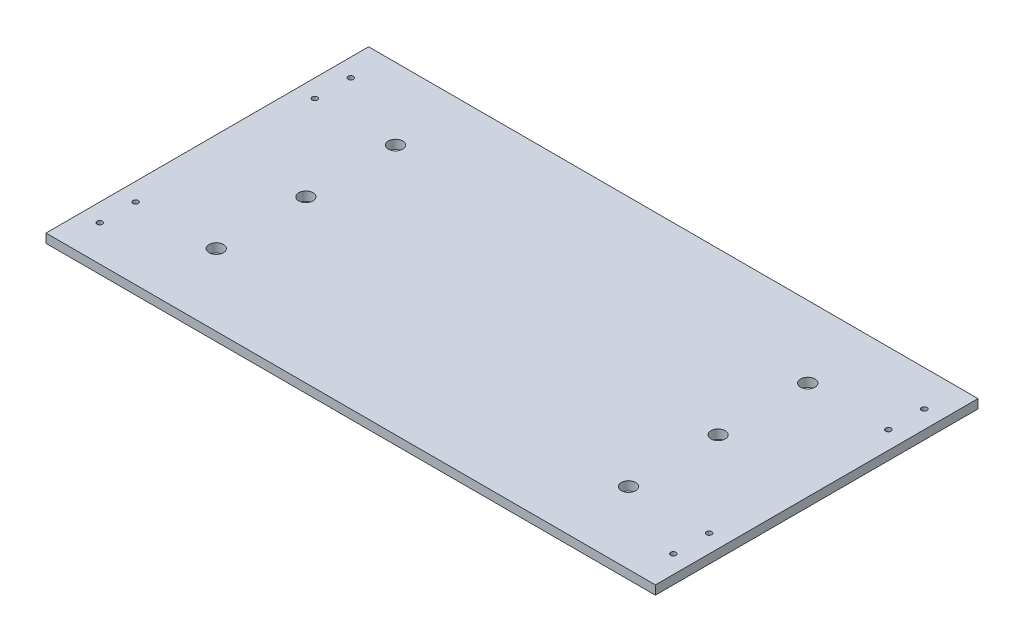
ISO-10303-21;
HEADER;
FILE_DESCRIPTION(('STEP AP214'),'2;1');
FILE_NAME('part.step','',(''),(''),'','','');
FILE_SCHEMA(('AUTOMOTIVE_DESIGN { 1 0 10303 214 1 1 1 1 }'));
ENDSEC;
DATA;
#1=APPLICATION_CONTEXT('core data for automotive mechanical design processes');
#2=APPLICATION_PROTOCOL_DEFINITION('international standard','automotive_design',2000,#1);
#3=PRODUCT_CONTEXT('',#1,'mechanical');
#4=PRODUCT('Part','Part','',(#3));
#5=PRODUCT_RELATED_PRODUCT_CATEGORY('part','',(#4));
#6=PRODUCT_DEFINITION_FORMATION('','',#4);
#7=PRODUCT_DEFINITION_CONTEXT('part definition',#1,'design');
#8=PRODUCT_DEFINITION('design','',#6,#7);
#9=PRODUCT_DEFINITION_SHAPE('','',#8);
#10=(LENGTH_UNIT() NAMED_UNIT(*) SI_UNIT(.MILLI.,.METRE.));
#11=(NAMED_UNIT(*) PLANE_ANGLE_UNIT() SI_UNIT($,.RADIAN.));
#12=(NAMED_UNIT(*) SI_UNIT($,.STERADIAN.) SOLID_ANGLE_UNIT());
#13=UNCERTAINTY_MEASURE_WITH_UNIT(LENGTH_MEASURE(1.E-05),#10,'distance_accuracy_value','');
#14=(GEOMETRIC_REPRESENTATION_CONTEXT(3) GLOBAL_UNCERTAINTY_ASSIGNED_CONTEXT((#13)) GLOBAL_UNIT_ASSIGNED_CONTEXT((#10,
#11,#12)) REPRESENTATION_CONTEXT('',''));
#15=CARTESIAN_POINT('',(0.,0.,0.));
#16=DIRECTION('',(0.,0.,1.));
#17=DIRECTION('',(1.,0.,0.));
#18=AXIS2_PLACEMENT_3D('',#15,#16,#17);
#19=CARTESIAN_POINT('',(0.,5.,0.));
#20=DIRECTION('',(-1.,0.,0.));
#21=DIRECTION('',(0.,0.,1.));
#22=AXIS2_PLACEMENT_3D('',#19,#20,#21);
#23=PLANE('',#22);
#24=DIRECTION('',(0.,0.,-1.));
#25=VECTOR('',#24,1.);
#26=CARTESIAN_POINT('',(0.,0.,0.));
#27=LINE('',#26,#25);
#28=CARTESIAN_POINT('',(0.,0.,0.));
#29=VERTEX_POINT('',#28);
#30=CARTESIAN_POINT('',(0.,0.,-180.));
#31=VERTEX_POINT('',#30);
#32=EDGE_CURVE('E98',#29,#31,#27,.T.);
#33=ORIENTED_EDGE('',*,*,#32,.T.);
#34=DIRECTION('',(0.,-1.,0.));
#35=VECTOR('',#34,1.);
#36=CARTESIAN_POINT('',(0.,5.,-180.));
#37=LINE('',#36,#35);
#38=CARTESIAN_POINT('',(0.,5.,-180.));
#39=VERTEX_POINT('',#38);
#40=EDGE_CURVE('E11',#39,#31,#37,.T.);
#41=ORIENTED_EDGE('',*,*,#40,.F.);
#42=DIRECTION('',(0.,0.,-1.));
#43=VECTOR('',#42,1.);
#44=CARTESIAN_POINT('',(0.,5.,0.));
#45=LINE('',#44,#43);
#46=CARTESIAN_POINT('',(0.,5.,0.));
#47=VERTEX_POINT('',#46);
#48=EDGE_CURVE('E86',#47,#39,#45,.T.);
#49=ORIENTED_EDGE('',*,*,#48,.F.);
#50=DIRECTION('',(0.,-1.,0.));
#51=VECTOR('',#50,1.);
#52=CARTESIAN_POINT('',(0.,5.,0.));
#53=LINE('',#52,#51);
#54=EDGE_CURVE('E94',#47,#29,#53,.T.);
#55=ORIENTED_EDGE('',*,*,#54,.T.);
#56=EDGE_LOOP('',(#33,#41,#49,#55));
#57=FACE_BOUND('',#56,.T.);
#58=ADVANCED_FACE('F35',(#57),#23,.F.);
#59=CARTESIAN_POINT('',(0.,5.,-180.));
#60=DIRECTION('',(0.,0.,1.));
#61=DIRECTION('',(1.,0.,0.));
#62=AXIS2_PLACEMENT_3D('',#59,#60,#61);
#63=PLANE('',#62);
#64=DIRECTION('',(-1.,0.,0.));
#65=VECTOR('',#64,1.);
#66=CARTESIAN_POINT('',(0.,0.,-180.));
#67=LINE('',#66,#65);
#68=CARTESIAN_POINT('',(-340.,0.,-180.));
#69=VERTEX_POINT('',#68);
#70=EDGE_CURVE('E90',#31,#69,#67,.T.);
#71=ORIENTED_EDGE('',*,*,#70,.T.);
#72=DIRECTION('',(0.,-1.,0.));
#73=VECTOR('',#72,1.);
#74=CARTESIAN_POINT('',(-340.,5.,-180.));
#75=LINE('',#74,#73);
#76=CARTESIAN_POINT('',(-340.,5.,-180.));
#77=VERTEX_POINT('',#76);
#78=EDGE_CURVE('E43',#77,#69,#75,.T.);
#79=ORIENTED_EDGE('',*,*,#78,.F.);
#80=DIRECTION('',(-1.,0.,0.));
#81=VECTOR('',#80,1.);
#82=CARTESIAN_POINT('',(0.,5.,-180.));
#83=LINE('',#82,#81);
#84=EDGE_CURVE('E81',#39,#77,#83,.T.);
#85=ORIENTED_EDGE('',*,*,#84,.F.);
#86=ORIENTED_EDGE('',*,*,#40,.T.);
#87=EDGE_LOOP('',(#71,#79,#85,#86));
#88=FACE_BOUND('',#87,.T.);
#89=ADVANCED_FACE('F89',(#88),#63,.F.);
#90=CARTESIAN_POINT('',(-340.,5.,0.));
#91=DIRECTION('',(1.,0.,0.));
#92=DIRECTION('',(0.,0.,-1.));
#93=AXIS2_PLACEMENT_3D('',#90,#91,#92);
#94=PLANE('',#93);
#95=DIRECTION('',(0.,0.,1.));
#96=VECTOR('',#95,1.);
#97=CARTESIAN_POINT('',(-340.,0.,0.));
#98=LINE('',#97,#96);
#99=CARTESIAN_POINT('',(-340.,0.,0.));
#100=VERTEX_POINT('',#99);
#101=EDGE_CURVE('E68',#69,#100,#98,.T.);
#102=ORIENTED_EDGE('',*,*,#101,.T.);
#103=DIRECTION('',(0.,-1.,0.));
#104=VECTOR('',#103,1.);
#105=CARTESIAN_POINT('',(-340.,5.,0.));
#106=LINE('',#105,#104);
#107=CARTESIAN_POINT('',(-340.,5.,0.));
#108=VERTEX_POINT('',#107);
#109=EDGE_CURVE('E91',#108,#100,#106,.T.);
#110=ORIENTED_EDGE('',*,*,#109,.F.);
#111=DIRECTION('',(0.,0.,1.));
#112=VECTOR('',#111,1.);
#113=CARTESIAN_POINT('',(-340.,5.,0.));
#114=LINE('',#113,#112);
#115=EDGE_CURVE('E84',#77,#108,#114,.T.);
#116=ORIENTED_EDGE('',*,*,#115,.F.);
#117=ORIENTED_EDGE('',*,*,#78,.T.);
#118=EDGE_LOOP('',(#102,#110,#116,#117));
#119=FACE_BOUND('',#118,.T.);
#120=ADVANCED_FACE('F92',(#119),#94,.F.);
#121=CARTESIAN_POINT('',(0.,5.,0.));
#122=DIRECTION('',(0.,0.,-1.));
#123=DIRECTION('',(-1.,0.,0.));
#124=AXIS2_PLACEMENT_3D('',#121,#122,#123);
#125=PLANE('',#124);
#126=DIRECTION('',(1.,0.,0.));
#127=VECTOR('',#126,1.);
#128=CARTESIAN_POINT('',(0.,0.,0.));
#129=LINE('',#128,#127);
#130=EDGE_CURVE('E74',#100,#29,#129,.T.);
#131=ORIENTED_EDGE('',*,*,#130,.T.);
#132=ORIENTED_EDGE('',*,*,#54,.F.);
#133=DIRECTION('',(1.,0.,0.));
#134=VECTOR('',#133,1.);
#135=CARTESIAN_POINT('',(0.,5.,0.));
#136=LINE('',#135,#134);
#137=EDGE_CURVE('E51',#108,#47,#136,.T.);
#138=ORIENTED_EDGE('',*,*,#137,.F.);
#139=ORIENTED_EDGE('',*,*,#109,.T.);
#140=EDGE_LOOP('',(#131,#132,#138,#139));
#141=FACE_BOUND('',#140,.T.);
#142=ADVANCED_FACE('F106',(#141),#125,.F.);
#143=CARTESIAN_POINT('',(0.,5.,0.));
#144=DIRECTION('',(0.,1.,0.));
#145=DIRECTION('',(0.,0.,1.));
#146=AXIS2_PLACEMENT_3D('',#143,#144,#145);
#147=PLANE('',#146);
#148=CARTESIAN_POINT('',(-55.,5.,-140.));
#149=DIRECTION('',(0.,1.,0.));
#150=DIRECTION('',(0.,0.,-1.));
#151=AXIS2_PLACEMENT_3D('',#148,#149,#150);
#152=CIRCLE('',#151,4.00000000000001);
#153=CARTESIAN_POINT('',(-55.,5.,-144.));
#154=VERTEX_POINT('',#153);
#155=EDGE_CURVE('E166',#154,#154,#152,.T.);
#156=ORIENTED_EDGE('',*,*,#155,.F.);
#157=EDGE_LOOP('',(#156));
#158=FACE_BOUND('',#157,.T.);
#159=CARTESIAN_POINT('',(-55.,5.,-90.));
#160=DIRECTION('',(0.,1.,0.));
#161=DIRECTION('',(0.,0.,-1.));
#162=AXIS2_PLACEMENT_3D('',#159,#160,#161);
#163=CIRCLE('',#162,4.00000000000001);
#164=CARTESIAN_POINT('',(-55.,5.,-94.));
#165=VERTEX_POINT('',#164);
#166=EDGE_CURVE('E172',#165,#165,#163,.T.);
#167=ORIENTED_EDGE('',*,*,#166,.F.);
#168=EDGE_LOOP('',(#167));
#169=FACE_BOUND('',#168,.T.);
#170=CARTESIAN_POINT('',(-55.,5.,-40.));
#171=DIRECTION('',(0.,1.,0.));
#172=DIRECTION('',(0.,0.,-1.));
#173=AXIS2_PLACEMENT_3D('',#170,#171,#172);
#174=CIRCLE('',#173,4.00000000000001);
#175=CARTESIAN_POINT('',(-55.,5.,-44.));
#176=VERTEX_POINT('',#175);
#177=EDGE_CURVE('E178',#176,#176,#174,.T.);
#178=ORIENTED_EDGE('',*,*,#177,.F.);
#179=EDGE_LOOP('',(#178));
#180=FACE_BOUND('',#179,.T.);
#181=CARTESIAN_POINT('',(-285.,5.,-40.));
#182=DIRECTION('',(0.,1.,0.));
#183=DIRECTION('',(0.,0.,1.));
#184=AXIS2_PLACEMENT_3D('',#181,#182,#183);
#185=CIRCLE('',#184,3.99999999999999);
#186=CARTESIAN_POINT('',(-285.,5.,-36.));
#187=VERTEX_POINT('',#186);
#188=EDGE_CURVE('E184',#187,#187,#185,.T.);
#189=ORIENTED_EDGE('',*,*,#188,.F.);
#190=EDGE_LOOP('',(#189));
#191=FACE_BOUND('',#190,.T.);
#192=CARTESIAN_POINT('',(-285.,5.,-90.));
#193=DIRECTION('',(0.,1.,0.));
#194=DIRECTION('',(0.,0.,1.));
#195=AXIS2_PLACEMENT_3D('',#192,#193,#194);
#196=CIRCLE('',#195,3.99999999999999);
#197=CARTESIAN_POINT('',(-285.,5.,-86.));
#198=VERTEX_POINT('',#197);
#199=EDGE_CURVE('E190',#198,#198,#196,.T.);
#200=ORIENTED_EDGE('',*,*,#199,.F.);
#201=EDGE_LOOP('',(#200));
#202=FACE_BOUND('',#201,.T.);
#203=CARTESIAN_POINT('',(-285.,5.,-140.));
#204=DIRECTION('',(0.,1.,0.));
#205=DIRECTION('',(0.,0.,1.));
#206=AXIS2_PLACEMENT_3D('',#203,#204,#205);
#207=CIRCLE('',#206,3.99999999999999);
#208=CARTESIAN_POINT('',(-285.,5.,-136.));
#209=VERTEX_POINT('',#208);
#210=EDGE_CURVE('E160',#209,#209,#207,.T.);
#211=ORIENTED_EDGE('',*,*,#210,.F.);
#212=EDGE_LOOP('',(#211));
#213=FACE_BOUND('',#212,.T.);
#214=CARTESIAN_POINT('',(-330.,5.,-40.));
#215=DIRECTION('',(0.,1.,0.));
#216=DIRECTION('',(0.,0.,1.));
#217=AXIS2_PLACEMENT_3D('',#214,#215,#216);
#218=CIRCLE('',#217,1.50000000000002);
#219=CARTESIAN_POINT('',(-330.,5.,-38.5));
#220=VERTEX_POINT('',#219);
#221=EDGE_CURVE('E137',#220,#220,#218,.T.);
#222=ORIENTED_EDGE('',*,*,#221,.F.);
#223=EDGE_LOOP('',(#222));
#224=FACE_BOUND('',#223,.T.);
#225=CARTESIAN_POINT('',(-330.,5.,-140.));
#226=DIRECTION('',(0.,1.,0.));
#227=DIRECTION('',(0.,0.,-1.));
#228=AXIS2_PLACEMENT_3D('',#225,#226,#227);
#229=CIRCLE('',#228,1.50000000000002);
#230=CARTESIAN_POINT('',(-330.,5.,-141.5));
#231=VERTEX_POINT('',#230);
#232=EDGE_CURVE('E131',#231,#231,#229,.T.);
#233=ORIENTED_EDGE('',*,*,#232,.F.);
#234=EDGE_LOOP('',(#233));
#235=FACE_BOUND('',#234,.T.);
#236=CARTESIAN_POINT('',(-330.,5.,-160.));
#237=DIRECTION('',(0.,1.,0.));
#238=DIRECTION('',(0.,0.,-1.));
#239=AXIS2_PLACEMENT_3D('',#236,#237,#238);
#240=CIRCLE('',#239,1.50000000000002);
#241=CARTESIAN_POINT('',(-330.,5.,-161.5));
#242=VERTEX_POINT('',#241);
#243=EDGE_CURVE('E125',#242,#242,#240,.T.);
#244=ORIENTED_EDGE('',*,*,#243,.F.);
#245=EDGE_LOOP('',(#244));
#246=FACE_BOUND('',#245,.T.);
#247=CARTESIAN_POINT('',(-10.,5.,-160.));
#248=DIRECTION('',(0.,1.,0.));
#249=DIRECTION('',(0.,0.,1.));
#250=AXIS2_PLACEMENT_3D('',#247,#248,#249);
#251=CIRCLE('',#250,1.50000000000002);
#252=CARTESIAN_POINT('',(-10.,5.,-158.5));
#253=VERTEX_POINT('',#252);
#254=EDGE_CURVE('E118',#253,#253,#251,.T.);
#255=ORIENTED_EDGE('',*,*,#254,.F.);
#256=EDGE_LOOP('',(#255));
#257=FACE_BOUND('',#256,.T.);
#258=CARTESIAN_POINT('',(-10.,5.,-140.));
#259=DIRECTION('',(0.,1.,0.));
#260=DIRECTION('',(0.,0.,1.));
#261=AXIS2_PLACEMENT_3D('',#258,#259,#260);
#262=CIRCLE('',#261,1.50000000000002);
#263=CARTESIAN_POINT('',(-10.,5.,-138.5));
#264=VERTEX_POINT('',#263);
#265=EDGE_CURVE('E155',#264,#264,#262,.T.);
#266=ORIENTED_EDGE('',*,*,#265,.F.);
#267=EDGE_LOOP('',(#266));
#268=FACE_BOUND('',#267,.T.);
#269=CARTESIAN_POINT('',(-10.,5.,-40.));
#270=DIRECTION('',(0.,1.,0.));
#271=DIRECTION('',(0.,0.,-1.));
#272=AXIS2_PLACEMENT_3D('',#269,#270,#271);
#273=CIRCLE('',#272,1.50000000000002);
#274=CARTESIAN_POINT('',(-10.,5.,-41.5));
#275=VERTEX_POINT('',#274);
#276=EDGE_CURVE('E149',#275,#275,#273,.T.);
#277=ORIENTED_EDGE('',*,*,#276,.F.);
#278=EDGE_LOOP('',(#277));
#279=FACE_BOUND('',#278,.T.);
#280=CARTESIAN_POINT('',(-10.,5.,-20.));
#281=DIRECTION('',(0.,1.,0.));
#282=DIRECTION('',(0.,0.,-1.));
#283=AXIS2_PLACEMENT_3D('',#280,#281,#282);
#284=CIRCLE('',#283,1.50000000000002);
#285=CARTESIAN_POINT('',(-10.,5.,-21.5));
#286=VERTEX_POINT('',#285);
#287=EDGE_CURVE('E142',#286,#286,#284,.T.);
#288=ORIENTED_EDGE('',*,*,#287,.F.);
#289=EDGE_LOOP('',(#288));
#290=FACE_BOUND('',#289,.T.);
#291=CARTESIAN_POINT('',(-330.,5.,-20.));
#292=DIRECTION('',(0.,1.,0.));
#293=DIRECTION('',(0.,0.,1.));
#294=AXIS2_PLACEMENT_3D('',#291,#292,#293);
#295=CIRCLE('',#294,1.50000000000002);
#296=CARTESIAN_POINT('',(-330.,5.,-18.5));
#297=VERTEX_POINT('',#296);
#298=EDGE_CURVE('E112',#297,#297,#295,.T.);
#299=ORIENTED_EDGE('',*,*,#298,.F.);
#300=EDGE_LOOP('',(#299));
#301=FACE_BOUND('',#300,.T.);
#302=ORIENTED_EDGE('',*,*,#48,.T.);
#303=ORIENTED_EDGE('',*,*,#84,.T.);
#304=ORIENTED_EDGE('',*,*,#115,.T.);
#305=ORIENTED_EDGE('',*,*,#137,.T.);
#306=EDGE_LOOP('',(#302,#303,#304,#305));
#307=FACE_BOUND('',#306,.T.);
#308=ADVANCED_FACE('F82',(#158,#169,#180,#191,#202,#213,#224,#235,#246,#257,#268,#279,#290,#301,
#307),#147,.T.);
#309=CARTESIAN_POINT('',(0.,0.,0.));
#310=DIRECTION('',(0.,1.,0.));
#311=DIRECTION('',(0.,0.,1.));
#312=AXIS2_PLACEMENT_3D('',#309,#310,#311);
#313=PLANE('',#312);
#314=CARTESIAN_POINT('',(-55.,0.,-140.));
#315=DIRECTION('',(0.,1.,0.));
#316=DIRECTION('',(0.,0.,-1.));
#317=AXIS2_PLACEMENT_3D('',#314,#315,#316);
#318=CIRCLE('',#317,4.00000000000001);
#319=CARTESIAN_POINT('',(-55.,0.,-144.));
#320=VERTEX_POINT('',#319);
#321=EDGE_CURVE('E169',#320,#320,#318,.T.);
#322=ORIENTED_EDGE('',*,*,#321,.T.);
#323=EDGE_LOOP('',(#322));
#324=FACE_BOUND('',#323,.T.);
#325=CARTESIAN_POINT('',(-55.,0.,-90.));
#326=DIRECTION('',(0.,1.,0.));
#327=DIRECTION('',(0.,0.,-1.));
#328=AXIS2_PLACEMENT_3D('',#325,#326,#327);
#329=CIRCLE('',#328,4.00000000000001);
#330=CARTESIAN_POINT('',(-55.,0.,-94.));
#331=VERTEX_POINT('',#330);
#332=EDGE_CURVE('E175',#331,#331,#329,.T.);
#333=ORIENTED_EDGE('',*,*,#332,.T.);
#334=EDGE_LOOP('',(#333));
#335=FACE_BOUND('',#334,.T.);
#336=CARTESIAN_POINT('',(-55.,0.,-40.));
#337=DIRECTION('',(0.,1.,0.));
#338=DIRECTION('',(0.,0.,-1.));
#339=AXIS2_PLACEMENT_3D('',#336,#337,#338);
#340=CIRCLE('',#339,4.00000000000001);
#341=CARTESIAN_POINT('',(-55.,0.,-44.));
#342=VERTEX_POINT('',#341);
#343=EDGE_CURVE('E181',#342,#342,#340,.T.);
#344=ORIENTED_EDGE('',*,*,#343,.T.);
#345=EDGE_LOOP('',(#344));
#346=FACE_BOUND('',#345,.T.);
#347=CARTESIAN_POINT('',(-285.,0.,-40.));
#348=DIRECTION('',(0.,1.,0.));
#349=DIRECTION('',(0.,0.,1.));
#350=AXIS2_PLACEMENT_3D('',#347,#348,#349);
#351=CIRCLE('',#350,3.99999999999999);
#352=CARTESIAN_POINT('',(-285.,0.,-36.));
#353=VERTEX_POINT('',#352);
#354=EDGE_CURVE('E187',#353,#353,#351,.T.);
#355=ORIENTED_EDGE('',*,*,#354,.T.);
#356=EDGE_LOOP('',(#355));
#357=FACE_BOUND('',#356,.T.);
#358=CARTESIAN_POINT('',(-285.,0.,-90.));
#359=DIRECTION('',(0.,1.,0.));
#360=DIRECTION('',(0.,0.,1.));
#361=AXIS2_PLACEMENT_3D('',#358,#359,#360);
#362=CIRCLE('',#361,3.99999999999999);
#363=CARTESIAN_POINT('',(-285.,0.,-86.));
#364=VERTEX_POINT('',#363);
#365=EDGE_CURVE('E163',#364,#364,#362,.T.);
#366=ORIENTED_EDGE('',*,*,#365,.T.);
#367=EDGE_LOOP('',(#366));
#368=FACE_BOUND('',#367,.T.);
#369=CARTESIAN_POINT('',(-285.,0.,-140.));
#370=DIRECTION('',(0.,1.,0.));
#371=DIRECTION('',(0.,0.,1.));
#372=AXIS2_PLACEMENT_3D('',#369,#370,#371);
#373=CIRCLE('',#372,3.99999999999999);
#374=CARTESIAN_POINT('',(-285.,0.,-136.));
#375=VERTEX_POINT('',#374);
#376=EDGE_CURVE('E146',#375,#375,#373,.T.);
#377=ORIENTED_EDGE('',*,*,#376,.T.);
#378=EDGE_LOOP('',(#377));
#379=FACE_BOUND('',#378,.T.);
#380=CARTESIAN_POINT('',(-330.,0.,-40.));
#381=DIRECTION('',(0.,1.,0.));
#382=DIRECTION('',(0.,0.,1.));
#383=AXIS2_PLACEMENT_3D('',#380,#381,#382);
#384=CIRCLE('',#383,1.50000000000002);
#385=CARTESIAN_POINT('',(-330.,0.,-38.5));
#386=VERTEX_POINT('',#385);
#387=EDGE_CURVE('E115',#386,#386,#384,.T.);
#388=ORIENTED_EDGE('',*,*,#387,.T.);
#389=EDGE_LOOP('',(#388));
#390=FACE_BOUND('',#389,.T.);
#391=CARTESIAN_POINT('',(-330.,0.,-140.));
#392=DIRECTION('',(0.,1.,0.));
#393=DIRECTION('',(0.,0.,-1.));
#394=AXIS2_PLACEMENT_3D('',#391,#392,#393);
#395=CIRCLE('',#394,1.50000000000002);
#396=CARTESIAN_POINT('',(-330.,0.,-141.5));
#397=VERTEX_POINT('',#396);
#398=EDGE_CURVE('E134',#397,#397,#395,.T.);
#399=ORIENTED_EDGE('',*,*,#398,.T.);
#400=EDGE_LOOP('',(#399));
#401=FACE_BOUND('',#400,.T.);
#402=CARTESIAN_POINT('',(-330.,0.,-160.));
#403=DIRECTION('',(0.,1.,0.));
#404=DIRECTION('',(0.,0.,-1.));
#405=AXIS2_PLACEMENT_3D('',#402,#403,#404);
#406=CIRCLE('',#405,1.50000000000002);
#407=CARTESIAN_POINT('',(-330.,0.,-161.5));
#408=VERTEX_POINT('',#407);
#409=EDGE_CURVE('E128',#408,#408,#406,.T.);
#410=ORIENTED_EDGE('',*,*,#409,.T.);
#411=EDGE_LOOP('',(#410));
#412=FACE_BOUND('',#411,.T.);
#413=CARTESIAN_POINT('',(-10.,0.,-160.));
#414=DIRECTION('',(0.,1.,0.));
#415=DIRECTION('',(0.,0.,1.));
#416=AXIS2_PLACEMENT_3D('',#413,#414,#415);
#417=CIRCLE('',#416,1.50000000000002);
#418=CARTESIAN_POINT('',(-10.,0.,-158.5));
#419=VERTEX_POINT('',#418);
#420=EDGE_CURVE('E121',#419,#419,#417,.T.);
#421=ORIENTED_EDGE('',*,*,#420,.T.);
#422=EDGE_LOOP('',(#421));
#423=FACE_BOUND('',#422,.T.);
#424=CARTESIAN_POINT('',(-10.,0.,-140.));
#425=DIRECTION('',(0.,1.,0.));
#426=DIRECTION('',(0.,0.,1.));
#427=AXIS2_PLACEMENT_3D('',#424,#425,#426);
#428=CIRCLE('',#427,1.50000000000002);
#429=CARTESIAN_POINT('',(-10.,0.,-138.5));
#430=VERTEX_POINT('',#429);
#431=EDGE_CURVE('E122',#430,#430,#428,.T.);
#432=ORIENTED_EDGE('',*,*,#431,.T.);
#433=EDGE_LOOP('',(#432));
#434=FACE_BOUND('',#433,.T.);
#435=CARTESIAN_POINT('',(-10.,0.,-40.));
#436=DIRECTION('',(0.,1.,0.));
#437=DIRECTION('',(0.,0.,-1.));
#438=AXIS2_PLACEMENT_3D('',#435,#436,#437);
#439=CIRCLE('',#438,1.50000000000002);
#440=CARTESIAN_POINT('',(-10.,0.,-41.5));
#441=VERTEX_POINT('',#440);
#442=EDGE_CURVE('E152',#441,#441,#439,.T.);
#443=ORIENTED_EDGE('',*,*,#442,.T.);
#444=EDGE_LOOP('',(#443));
#445=FACE_BOUND('',#444,.T.);
#446=CARTESIAN_POINT('',(-10.,0.,-20.));
#447=DIRECTION('',(0.,1.,0.));
#448=DIRECTION('',(0.,0.,-1.));
#449=AXIS2_PLACEMENT_3D('',#446,#447,#448);
#450=CIRCLE('',#449,1.50000000000002);
#451=CARTESIAN_POINT('',(-10.,0.,-21.5));
#452=VERTEX_POINT('',#451);
#453=EDGE_CURVE('E145',#452,#452,#450,.T.);
#454=ORIENTED_EDGE('',*,*,#453,.T.);
#455=EDGE_LOOP('',(#454));
#456=FACE_BOUND('',#455,.T.);
#457=CARTESIAN_POINT('',(-330.,0.,-20.));
#458=DIRECTION('',(0.,1.,0.));
#459=DIRECTION('',(0.,0.,1.));
#460=AXIS2_PLACEMENT_3D('',#457,#458,#459);
#461=CIRCLE('',#460,1.50000000000002);
#462=CARTESIAN_POINT('',(-330.,0.,-18.5));
#463=VERTEX_POINT('',#462);
#464=EDGE_CURVE('E101',#463,#463,#461,.T.);
#465=ORIENTED_EDGE('',*,*,#464,.T.);
#466=EDGE_LOOP('',(#465));
#467=FACE_BOUND('',#466,.T.);
#468=ORIENTED_EDGE('',*,*,#32,.F.);
#469=ORIENTED_EDGE('',*,*,#130,.F.);
#470=ORIENTED_EDGE('',*,*,#101,.F.);
#471=ORIENTED_EDGE('',*,*,#70,.F.);
#472=EDGE_LOOP('',(#468,#469,#470,#471));
#473=FACE_BOUND('',#472,.T.);
#474=ADVANCED_FACE('F109',(#324,#335,#346,#357,#368,#379,#390,#401,#412,#423,#434,#445,#456,
#467,#473),#313,.F.);
#475=CARTESIAN_POINT('',(-330.,0.,-20.));
#476=DIRECTION('',(0.,1.,0.));
#477=DIRECTION('',(0.,0.,1.));
#478=AXIS2_PLACEMENT_3D('',#475,#476,#477);
#479=CYLINDRICAL_SURFACE('',#478,1.50000000000002);
#480=ORIENTED_EDGE('',*,*,#464,.F.);
#481=EDGE_LOOP('',(#480));
#482=FACE_BOUND('',#481,.T.);
#483=ORIENTED_EDGE('',*,*,#298,.T.);
#484=EDGE_LOOP('',(#483));
#485=FACE_BOUND('',#484,.T.);
#486=ADVANCED_FACE('F228',(#482,#485),#479,.F.);
#487=CARTESIAN_POINT('',(-10.,0.,-20.));
#488=DIRECTION('',(0.,1.,0.));
#489=DIRECTION('',(0.,0.,1.));
#490=AXIS2_PLACEMENT_3D('',#487,#488,#489);
#491=CYLINDRICAL_SURFACE('',#490,1.50000000000002);
#492=ORIENTED_EDGE('',*,*,#453,.F.);
#493=EDGE_LOOP('',(#492));
#494=FACE_BOUND('',#493,.T.);
#495=ORIENTED_EDGE('',*,*,#287,.T.);
#496=EDGE_LOOP('',(#495));
#497=FACE_BOUND('',#496,.T.);
#498=ADVANCED_FACE('F230',(#494,#497),#491,.F.);
#499=CARTESIAN_POINT('',(-10.,0.,-40.));
#500=DIRECTION('',(0.,1.,0.));
#501=DIRECTION('',(0.,0.,1.));
#502=AXIS2_PLACEMENT_3D('',#499,#500,#501);
#503=CYLINDRICAL_SURFACE('',#502,1.50000000000002);
#504=ORIENTED_EDGE('',*,*,#442,.F.);
#505=EDGE_LOOP('',(#504));
#506=FACE_BOUND('',#505,.T.);
#507=ORIENTED_EDGE('',*,*,#276,.T.);
#508=EDGE_LOOP('',(#507));
#509=FACE_BOUND('',#508,.T.);
#510=ADVANCED_FACE('F237',(#506,#509),#503,.F.);
#511=CARTESIAN_POINT('',(-10.,0.,-140.));
#512=DIRECTION('',(0.,1.,0.));
#513=DIRECTION('',(0.,0.,1.));
#514=AXIS2_PLACEMENT_3D('',#511,#512,#513);
#515=CYLINDRICAL_SURFACE('',#514,1.50000000000002);
#516=ORIENTED_EDGE('',*,*,#431,.F.);
#517=EDGE_LOOP('',(#516));
#518=FACE_BOUND('',#517,.T.);
#519=ORIENTED_EDGE('',*,*,#265,.T.);
#520=EDGE_LOOP('',(#519));
#521=FACE_BOUND('',#520,.T.);
#522=ADVANCED_FACE('F332',(#518,#521),#515,.F.);
#523=CARTESIAN_POINT('',(-10.,0.,-160.));
#524=DIRECTION('',(0.,1.,0.));
#525=DIRECTION('',(0.,0.,1.));
#526=AXIS2_PLACEMENT_3D('',#523,#524,#525);
#527=CYLINDRICAL_SURFACE('',#526,1.50000000000002);
#528=ORIENTED_EDGE('',*,*,#420,.F.);
#529=EDGE_LOOP('',(#528));
#530=FACE_BOUND('',#529,.T.);
#531=ORIENTED_EDGE('',*,*,#254,.T.);
#532=EDGE_LOOP('',(#531));
#533=FACE_BOUND('',#532,.T.);
#534=ADVANCED_FACE('F335',(#530,#533),#527,.F.);
#535=CARTESIAN_POINT('',(-330.,0.,-160.));
#536=DIRECTION('',(0.,1.,0.));
#537=DIRECTION('',(0.,0.,1.));
#538=AXIS2_PLACEMENT_3D('',#535,#536,#537);
#539=CYLINDRICAL_SURFACE('',#538,1.50000000000002);
#540=ORIENTED_EDGE('',*,*,#409,.F.);
#541=EDGE_LOOP('',(#540));
#542=FACE_BOUND('',#541,.T.);
#543=ORIENTED_EDGE('',*,*,#243,.T.);
#544=EDGE_LOOP('',(#543));
#545=FACE_BOUND('',#544,.T.);
#546=ADVANCED_FACE('F345',(#542,#545),#539,.F.);
#547=CARTESIAN_POINT('',(-330.,0.,-140.));
#548=DIRECTION('',(0.,1.,0.));
#549=DIRECTION('',(0.,0.,1.));
#550=AXIS2_PLACEMENT_3D('',#547,#548,#549);
#551=CYLINDRICAL_SURFACE('',#550,1.50000000000002);
#552=ORIENTED_EDGE('',*,*,#398,.F.);
#553=EDGE_LOOP('',(#552));
#554=FACE_BOUND('',#553,.T.);
#555=ORIENTED_EDGE('',*,*,#232,.T.);
#556=EDGE_LOOP('',(#555));
#557=FACE_BOUND('',#556,.T.);
#558=ADVANCED_FACE('F341',(#554,#557),#551,.F.);
#559=CARTESIAN_POINT('',(-330.,0.,-40.));
#560=DIRECTION('',(0.,1.,0.));
#561=DIRECTION('',(0.,0.,1.));
#562=AXIS2_PLACEMENT_3D('',#559,#560,#561);
#563=CYLINDRICAL_SURFACE('',#562,1.50000000000002);
#564=ORIENTED_EDGE('',*,*,#387,.F.);
#565=EDGE_LOOP('',(#564));
#566=FACE_BOUND('',#565,.T.);
#567=ORIENTED_EDGE('',*,*,#221,.T.);
#568=EDGE_LOOP('',(#567));
#569=FACE_BOUND('',#568,.T.);
#570=ADVANCED_FACE('F277',(#566,#569),#563,.F.);
#571=CARTESIAN_POINT('',(-285.,0.,-140.));
#572=DIRECTION('',(0.,1.,0.));
#573=DIRECTION('',(0.,0.,1.));
#574=AXIS2_PLACEMENT_3D('',#571,#572,#573);
#575=CYLINDRICAL_SURFACE('',#574,3.99999999999999);
#576=ORIENTED_EDGE('',*,*,#376,.F.);
#577=EDGE_LOOP('',(#576));
#578=FACE_BOUND('',#577,.T.);
#579=ORIENTED_EDGE('',*,*,#210,.T.);
#580=EDGE_LOOP('',(#579));
#581=FACE_BOUND('',#580,.T.);
#582=ADVANCED_FACE('F202',(#578,#581),#575,.F.);
#583=CARTESIAN_POINT('',(-285.,0.,-90.));
#584=DIRECTION('',(0.,1.,0.));
#585=DIRECTION('',(0.,0.,1.));
#586=AXIS2_PLACEMENT_3D('',#583,#584,#585);
#587=CYLINDRICAL_SURFACE('',#586,3.99999999999999);
#588=ORIENTED_EDGE('',*,*,#365,.F.);
#589=EDGE_LOOP('',(#588));
#590=FACE_BOUND('',#589,.T.);
#591=ORIENTED_EDGE('',*,*,#199,.T.);
#592=EDGE_LOOP('',(#591));
#593=FACE_BOUND('',#592,.T.);
#594=ADVANCED_FACE('F198',(#590,#593),#587,.F.);
#595=CARTESIAN_POINT('',(-285.,0.,-40.));
#596=DIRECTION('',(0.,1.,0.));
#597=DIRECTION('',(0.,0.,1.));
#598=AXIS2_PLACEMENT_3D('',#595,#596,#597);
#599=CYLINDRICAL_SURFACE('',#598,3.99999999999999);
#600=ORIENTED_EDGE('',*,*,#354,.F.);
#601=EDGE_LOOP('',(#600));
#602=FACE_BOUND('',#601,.T.);
#603=ORIENTED_EDGE('',*,*,#188,.T.);
#604=EDGE_LOOP('',(#603));
#605=FACE_BOUND('',#604,.T.);
#606=ADVANCED_FACE('F201',(#602,#605),#599,.F.);
#607=CARTESIAN_POINT('',(-55.,0.,-40.));
#608=DIRECTION('',(0.,1.,0.));
#609=DIRECTION('',(0.,0.,1.));
#610=AXIS2_PLACEMENT_3D('',#607,#608,#609);
#611=CYLINDRICAL_SURFACE('',#610,4.00000000000001);
#612=ORIENTED_EDGE('',*,*,#343,.F.);
#613=EDGE_LOOP('',(#612));
#614=FACE_BOUND('',#613,.T.);
#615=ORIENTED_EDGE('',*,*,#177,.T.);
#616=EDGE_LOOP('',(#615));
#617=FACE_BOUND('',#616,.T.);
#618=ADVANCED_FACE('F295',(#614,#617),#611,.F.);
#619=CARTESIAN_POINT('',(-55.,0.,-90.));
#620=DIRECTION('',(0.,1.,0.));
#621=DIRECTION('',(0.,0.,1.));
#622=AXIS2_PLACEMENT_3D('',#619,#620,#621);
#623=CYLINDRICAL_SURFACE('',#622,4.00000000000001);
#624=ORIENTED_EDGE('',*,*,#332,.F.);
#625=EDGE_LOOP('',(#624));
#626=FACE_BOUND('',#625,.T.);
#627=ORIENTED_EDGE('',*,*,#166,.T.);
#628=EDGE_LOOP('',(#627));
#629=FACE_BOUND('',#628,.T.);
#630=ADVANCED_FACE('F305',(#626,#629),#623,.F.);
#631=CARTESIAN_POINT('',(-55.,0.,-140.));
#632=DIRECTION('',(0.,1.,0.));
#633=DIRECTION('',(0.,0.,1.));
#634=AXIS2_PLACEMENT_3D('',#631,#632,#633);
#635=CYLINDRICAL_SURFACE('',#634,4.00000000000001);
#636=ORIENTED_EDGE('',*,*,#321,.F.);
#637=EDGE_LOOP('',(#636));
#638=FACE_BOUND('',#637,.T.);
#639=ORIENTED_EDGE('',*,*,#155,.T.);
#640=EDGE_LOOP('',(#639));
#641=FACE_BOUND('',#640,.T.);
#642=ADVANCED_FACE('F315',(#638,#641),#635,.F.);
#643=CLOSED_SHELL('',(#58,#89,#120,#142,#308,#474,#486,#498,#510,#522,#534,#546,#558,#570,#582,
#594,#606,#618,#630,#642));
#644=MANIFOLD_SOLID_BREP('B2',#643);
#645=ADVANCED_BREP_SHAPE_REPRESENTATION('',(#18,#644),#14);
#646=SHAPE_DEFINITION_REPRESENTATION(#9,#645);
ENDSEC;
END-ISO-10303-21;
